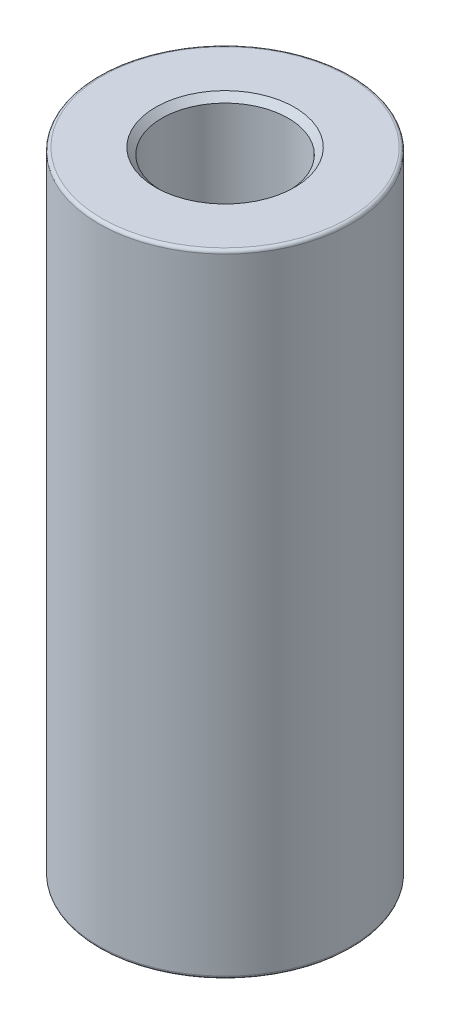
ISO-10303-21;
HEADER;
FILE_DESCRIPTION(('STEP AP214'),'2;1');
FILE_NAME('part.step','',(''),(''),'','','');
FILE_SCHEMA(('AUTOMOTIVE_DESIGN { 1 0 10303 214 1 1 1 1 }'));
ENDSEC;
DATA;
#1=APPLICATION_CONTEXT('core data for automotive mechanical design processes');
#2=APPLICATION_PROTOCOL_DEFINITION('international standard','automotive_design',2000,#1);
#3=PRODUCT_CONTEXT('',#1,'mechanical');
#4=PRODUCT('Part','Part','',(#3));
#5=PRODUCT_RELATED_PRODUCT_CATEGORY('part','',(#4));
#6=PRODUCT_DEFINITION_FORMATION('','',#4);
#7=PRODUCT_DEFINITION_CONTEXT('part definition',#1,'design');
#8=PRODUCT_DEFINITION('design','',#6,#7);
#9=PRODUCT_DEFINITION_SHAPE('','',#8);
#10=(LENGTH_UNIT() NAMED_UNIT(*) SI_UNIT(.MILLI.,.METRE.));
#11=(NAMED_UNIT(*) PLANE_ANGLE_UNIT() SI_UNIT($,.RADIAN.));
#12=(NAMED_UNIT(*) SI_UNIT($,.STERADIAN.) SOLID_ANGLE_UNIT());
#13=UNCERTAINTY_MEASURE_WITH_UNIT(LENGTH_MEASURE(1.E-05),#10,'distance_accuracy_value','');
#14=(GEOMETRIC_REPRESENTATION_CONTEXT(3) GLOBAL_UNCERTAINTY_ASSIGNED_CONTEXT((#13)) GLOBAL_UNIT_ASSIGNED_CONTEXT((#10,
#11,#12)) REPRESENTATION_CONTEXT('',''));
#15=CARTESIAN_POINT('',(0.,0.,0.));
#16=DIRECTION('',(0.,0.,1.));
#17=DIRECTION('',(1.,0.,0.));
#18=AXIS2_PLACEMENT_3D('',#15,#16,#17);
#19=CARTESIAN_POINT('',(0.,200.,0.));
#20=DIRECTION('',(0.,-1.,0.));
#21=DIRECTION('',(0.,0.,-1.));
#22=AXIS2_PLACEMENT_3D('',#19,#20,#21);
#23=CYLINDRICAL_SURFACE('',#22,40.);
#24=CARTESIAN_POINT('',(0.,199.,0.));
#25=DIRECTION('',(0.,1.,0.));
#26=DIRECTION('',(0.,0.,1.));
#27=AXIS2_PLACEMENT_3D('',#24,#25,#26);
#28=CIRCLE('',#27,40.);
#29=CARTESIAN_POINT('',(0.,199.,40.));
#30=VERTEX_POINT('',#29);
#31=EDGE_CURVE('E10',#30,#30,#28,.F.);
#32=ORIENTED_EDGE('',*,*,#31,.T.);
#33=EDGE_LOOP('',(#32));
#34=FACE_BOUND('',#33,.T.);
#35=CARTESIAN_POINT('',(0.,1.,0.));
#36=DIRECTION('',(0.,1.,0.));
#37=DIRECTION('',(0.,0.,1.));
#38=AXIS2_PLACEMENT_3D('',#35,#36,#37);
#39=CIRCLE('',#38,40.);
#40=CARTESIAN_POINT('',(0.,1.,40.));
#41=VERTEX_POINT('',#40);
#42=EDGE_CURVE('E48',#41,#41,#39,.T.);
#43=ORIENTED_EDGE('',*,*,#42,.T.);
#44=EDGE_LOOP('',(#43));
#45=FACE_BOUND('',#44,.T.);
#46=ADVANCED_FACE('F33',(#34,#45),#23,.T.);
#47=CARTESIAN_POINT('',(0.,200.,0.));
#48=DIRECTION('',(0.,1.,0.));
#49=DIRECTION('',(0.,0.,1.));
#50=AXIS2_PLACEMENT_3D('',#47,#48,#49);
#51=PLANE('',#50);
#52=CARTESIAN_POINT('',(0.,200.,0.));
#53=DIRECTION('',(0.,1.,0.));
#54=DIRECTION('',(0.,0.,1.));
#55=AXIS2_PLACEMENT_3D('',#52,#53,#54);
#56=CIRCLE('',#55,39.);
#57=CARTESIAN_POINT('',(0.,200.,39.));
#58=VERTEX_POINT('',#57);
#59=EDGE_CURVE('E40',#58,#58,#56,.T.);
#60=ORIENTED_EDGE('',*,*,#59,.T.);
#61=EDGE_LOOP('',(#60));
#62=FACE_BOUND('',#61,.T.);
#63=CARTESIAN_POINT('',(0.,200.,0.));
#64=DIRECTION('',(0.,1.,0.));
#65=DIRECTION('',(0.,0.,1.));
#66=AXIS2_PLACEMENT_3D('',#63,#64,#65);
#67=CIRCLE('',#66,22.);
#68=CARTESIAN_POINT('',(0.,200.,22.));
#69=VERTEX_POINT('',#68);
#70=EDGE_CURVE('E53',#69,#69,#67,.F.);
#71=ORIENTED_EDGE('',*,*,#70,.T.);
#72=EDGE_LOOP('',(#71));
#73=FACE_BOUND('',#72,.T.);
#74=ADVANCED_FACE('F76',(#62,#73),#51,.T.);
#75=CARTESIAN_POINT('',(0.,0.,0.));
#76=DIRECTION('',(0.,1.,0.));
#77=DIRECTION('',(0.,0.,1.));
#78=AXIS2_PLACEMENT_3D('',#75,#76,#77);
#79=PLANE('',#78);
#80=CARTESIAN_POINT('',(0.,0.,0.));
#81=DIRECTION('',(0.,1.,0.));
#82=DIRECTION('',(0.,0.,1.));
#83=AXIS2_PLACEMENT_3D('',#80,#81,#82);
#84=CIRCLE('',#83,39.);
#85=CARTESIAN_POINT('',(0.,0.,39.));
#86=VERTEX_POINT('',#85);
#87=EDGE_CURVE('E44',#86,#86,#84,.F.);
#88=ORIENTED_EDGE('',*,*,#87,.T.);
#89=EDGE_LOOP('',(#88));
#90=FACE_BOUND('',#89,.T.);
#91=ADVANCED_FACE('F67',(#90),#79,.F.);
#92=CARTESIAN_POINT('',(0.,50.,0.));
#93=DIRECTION('',(0.,1.,0.));
#94=DIRECTION('',(0.,0.,1.));
#95=AXIS2_PLACEMENT_3D('',#92,#93,#94);
#96=CYLINDRICAL_SURFACE('',#95,20.);
#97=CARTESIAN_POINT('',(0.,198.,0.));
#98=DIRECTION('',(0.,1.,0.));
#99=DIRECTION('',(0.,0.,1.));
#100=AXIS2_PLACEMENT_3D('',#97,#98,#99);
#101=CIRCLE('',#100,20.);
#102=CARTESIAN_POINT('',(0.,198.,20.));
#103=VERTEX_POINT('',#102);
#104=EDGE_CURVE('E56',#103,#103,#101,.T.);
#105=ORIENTED_EDGE('',*,*,#104,.T.);
#106=EDGE_LOOP('',(#105));
#107=FACE_BOUND('',#106,.T.);
#108=CARTESIAN_POINT('',(0.,50.,0.));
#109=DIRECTION('',(0.,1.,0.));
#110=DIRECTION('',(0.,0.,1.));
#111=AXIS2_PLACEMENT_3D('',#108,#109,#110);
#112=CIRCLE('',#111,20.);
#113=CARTESIAN_POINT('',(0.,50.,20.));
#114=VERTEX_POINT('',#113);
#115=EDGE_CURVE('E59',#114,#114,#112,.T.);
#116=ORIENTED_EDGE('',*,*,#115,.F.);
#117=EDGE_LOOP('',(#116));
#118=FACE_BOUND('',#117,.T.);
#119=ADVANCED_FACE('F65',(#107,#118),#96,.F.);
#120=CARTESIAN_POINT('',(0.,50.,0.));
#121=DIRECTION('',(0.,1.,0.));
#122=DIRECTION('',(0.,0.,1.));
#123=AXIS2_PLACEMENT_3D('',#120,#121,#122);
#124=PLANE('',#123);
#125=ORIENTED_EDGE('',*,*,#115,.T.);
#126=EDGE_LOOP('',(#125));
#127=FACE_BOUND('',#126,.T.);
#128=ADVANCED_FACE('F63',(#127),#124,.T.);
#129=CARTESIAN_POINT('',(0.,198.,0.));
#130=DIRECTION('',(0.,1.,0.));
#131=DIRECTION('',(0.,0.,1.));
#132=AXIS2_PLACEMENT_3D('',#129,#130,#131);
#133=CONICAL_SURFACE('',#132,20.,0.785398163397446);
#134=ORIENTED_EDGE('',*,*,#70,.F.);
#135=EDGE_LOOP('',(#134));
#136=FACE_BOUND('',#135,.T.);
#137=ORIENTED_EDGE('',*,*,#104,.F.);
#138=EDGE_LOOP('',(#137));
#139=FACE_BOUND('',#138,.T.);
#140=ADVANCED_FACE('F74',(#136,#139),#133,.F.);
#141=CARTESIAN_POINT('',(0.,1.,0.));
#142=DIRECTION('',(0.,1.,0.));
#143=DIRECTION('',(0.,0.,1.));
#144=AXIS2_PLACEMENT_3D('',#141,#142,#143);
#145=TOROIDAL_SURFACE('',#144,39.,1.);
#146=ORIENTED_EDGE('',*,*,#87,.F.);
#147=EDGE_LOOP('',(#146));
#148=FACE_BOUND('',#147,.T.);
#149=ORIENTED_EDGE('',*,*,#42,.F.);
#150=EDGE_LOOP('',(#149));
#151=FACE_BOUND('',#150,.T.);
#152=ADVANCED_FACE('F88',(#148,#151),#145,.T.);
#153=CARTESIAN_POINT('',(0.,199.,0.));
#154=DIRECTION('',(0.,1.,0.));
#155=DIRECTION('',(0.,0.,1.));
#156=AXIS2_PLACEMENT_3D('',#153,#154,#155);
#157=TOROIDAL_SURFACE('',#156,39.,1.);
#158=ORIENTED_EDGE('',*,*,#31,.F.);
#159=EDGE_LOOP('',(#158));
#160=FACE_BOUND('',#159,.T.);
#161=ORIENTED_EDGE('',*,*,#59,.F.);
#162=EDGE_LOOP('',(#161));
#163=FACE_BOUND('',#162,.T.);
#164=ADVANCED_FACE('F35',(#160,#163),#157,.T.);
#165=CLOSED_SHELL('',(#46,#74,#91,#119,#128,#140,#152,#164));
#166=MANIFOLD_SOLID_BREP('B2',#165);
#167=ADVANCED_BREP_SHAPE_REPRESENTATION('',(#18,#166),#14);
#168=SHAPE_DEFINITION_REPRESENTATION(#9,#167);
ENDSEC;
END-ISO-10303-21;
